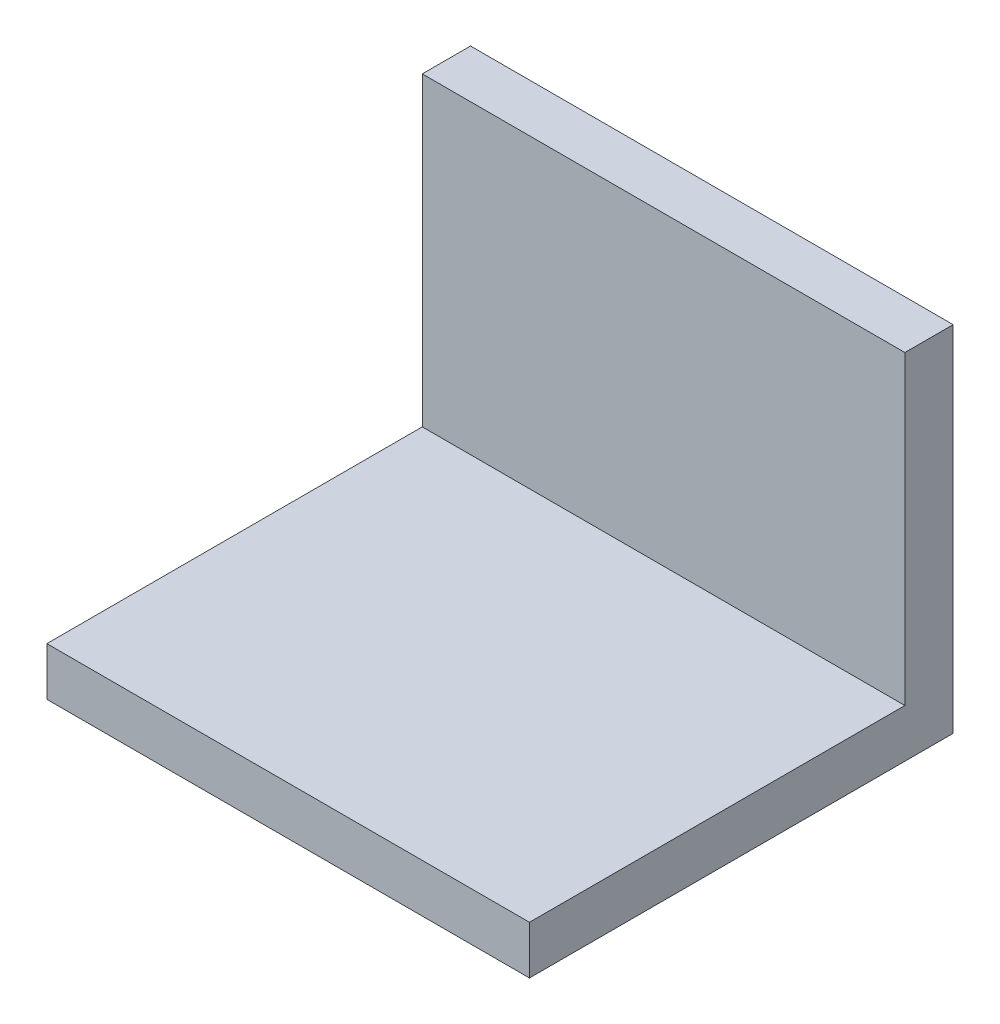
ISO-10303-21;
HEADER;
FILE_DESCRIPTION(('STEP AP214'),'2;1');
FILE_NAME('part.step','',(''),(''),'','','');
FILE_SCHEMA(('AUTOMOTIVE_DESIGN { 1 0 10303 214 1 1 1 1 }'));
ENDSEC;
DATA;
#1=APPLICATION_CONTEXT('core data for automotive mechanical design processes');
#2=APPLICATION_PROTOCOL_DEFINITION('international standard','automotive_design',2000,#1);
#3=PRODUCT_CONTEXT('',#1,'mechanical');
#4=PRODUCT('Part','Part','',(#3));
#5=PRODUCT_RELATED_PRODUCT_CATEGORY('part','',(#4));
#6=PRODUCT_DEFINITION_FORMATION('','',#4);
#7=PRODUCT_DEFINITION_CONTEXT('part definition',#1,'design');
#8=PRODUCT_DEFINITION('design','',#6,#7);
#9=PRODUCT_DEFINITION_SHAPE('','',#8);
#10=(LENGTH_UNIT() NAMED_UNIT(*) SI_UNIT(.MILLI.,.METRE.));
#11=(NAMED_UNIT(*) PLANE_ANGLE_UNIT() SI_UNIT($,.RADIAN.));
#12=(NAMED_UNIT(*) SI_UNIT($,.STERADIAN.) SOLID_ANGLE_UNIT());
#13=UNCERTAINTY_MEASURE_WITH_UNIT(LENGTH_MEASURE(1.E-05),#10,'distance_accuracy_value','');
#14=(GEOMETRIC_REPRESENTATION_CONTEXT(3) GLOBAL_UNCERTAINTY_ASSIGNED_CONTEXT((#13)) GLOBAL_UNIT_ASSIGNED_CONTEXT((#10,
#11,#12)) REPRESENTATION_CONTEXT('',''));
#15=CARTESIAN_POINT('',(0.,0.,0.));
#16=DIRECTION('',(0.,0.,1.));
#17=DIRECTION('',(1.,0.,0.));
#18=AXIS2_PLACEMENT_3D('',#15,#16,#17);
#19=CARTESIAN_POINT('',(-76.2,7.62,0.));
#20=DIRECTION('',(0.,0.,1.));
#21=DIRECTION('',(0.,-1.,0.));
#22=AXIS2_PLACEMENT_3D('',#19,#20,#21);
#23=PLANE('',#22);
#24=DIRECTION('',(0.,-1.,0.));
#25=VECTOR('',#24,1.);
#26=CARTESIAN_POINT('',(0.,7.62,0.));
#27=LINE('',#26,#25);
#28=CARTESIAN_POINT('',(0.,7.62,0.));
#29=VERTEX_POINT('',#28);
#30=CARTESIAN_POINT('',(0.,0.,0.));
#31=VERTEX_POINT('',#30);
#32=EDGE_CURVE('E116',#29,#31,#27,.T.);
#33=ORIENTED_EDGE('',*,*,#32,.F.);
#34=DIRECTION('',(1.,0.,0.));
#35=VECTOR('',#34,1.);
#36=CARTESIAN_POINT('',(-76.2,7.62,0.));
#37=LINE('',#36,#35);
#38=CARTESIAN_POINT('',(-76.2,7.62,0.));
#39=VERTEX_POINT('',#38);
#40=EDGE_CURVE('E11',#39,#29,#37,.T.);
#41=ORIENTED_EDGE('',*,*,#40,.F.);
#42=DIRECTION('',(0.,-1.,0.));
#43=VECTOR('',#42,1.);
#44=CARTESIAN_POINT('',(-76.2,7.62,0.));
#45=LINE('',#44,#43);
#46=CARTESIAN_POINT('',(-76.2,0.,0.));
#47=VERTEX_POINT('',#46);
#48=EDGE_CURVE('E130',#39,#47,#45,.T.);
#49=ORIENTED_EDGE('',*,*,#48,.T.);
#50=DIRECTION('',(1.,0.,0.));
#51=VECTOR('',#50,1.);
#52=CARTESIAN_POINT('',(-76.2,0.,0.));
#53=LINE('',#52,#51);
#54=EDGE_CURVE('E34',#47,#31,#53,.T.);
#55=ORIENTED_EDGE('',*,*,#54,.T.);
#56=EDGE_LOOP('',(#33,#41,#49,#55));
#57=FACE_BOUND('',#56,.T.);
#58=ADVANCED_FACE('F31',(#57),#23,.T.);
#59=CARTESIAN_POINT('',(-76.2,7.62000000000001,-59.2739513263459));
#60=DIRECTION('',(0.,1.,0.));
#61=DIRECTION('',(0.,0.,1.));
#62=AXIS2_PLACEMENT_3D('',#59,#60,#61);
#63=PLANE('',#62);
#64=DIRECTION('',(0.,0.,1.));
#65=VECTOR('',#64,1.);
#66=CARTESIAN_POINT('',(0.,7.62000000000001,-59.2739513263459));
#67=LINE('',#66,#65);
#68=CARTESIAN_POINT('',(0.,7.62000000000001,-59.2739513263459));
#69=VERTEX_POINT('',#68);
#70=EDGE_CURVE('E128',#69,#29,#67,.T.);
#71=ORIENTED_EDGE('',*,*,#70,.F.);
#72=DIRECTION('',(1.,0.,0.));
#73=VECTOR('',#72,1.);
#74=CARTESIAN_POINT('',(-76.2,7.62000000000001,-59.2739513263459));
#75=LINE('',#74,#73);
#76=CARTESIAN_POINT('',(-76.2,7.62000000000001,-59.2739513263459));
#77=VERTEX_POINT('',#76);
#78=EDGE_CURVE('E40',#77,#69,#75,.T.);
#79=ORIENTED_EDGE('',*,*,#78,.F.);
#80=DIRECTION('',(0.,0.,1.));
#81=VECTOR('',#80,1.);
#82=CARTESIAN_POINT('',(-76.2,7.62000000000001,-59.2739513263459));
#83=LINE('',#82,#81);
#84=EDGE_CURVE('E106',#77,#39,#83,.T.);
#85=ORIENTED_EDGE('',*,*,#84,.T.);
#86=ORIENTED_EDGE('',*,*,#40,.T.);
#87=EDGE_LOOP('',(#71,#79,#85,#86));
#88=FACE_BOUND('',#87,.T.);
#89=ADVANCED_FACE('F138',(#88),#63,.T.);
#90=CARTESIAN_POINT('',(-76.2,55.8859317943102,-59.2739513263459));
#91=DIRECTION('',(0.,0.,1.));
#92=DIRECTION('',(0.,-1.,0.));
#93=AXIS2_PLACEMENT_3D('',#90,#91,#92);
#94=PLANE('',#93);
#95=DIRECTION('',(0.,-1.,0.));
#96=VECTOR('',#95,1.);
#97=CARTESIAN_POINT('',(0.,55.8859317943102,-59.2739513263459));
#98=LINE('',#97,#96);
#99=CARTESIAN_POINT('',(0.,55.8859317943102,-59.2739513263459));
#100=VERTEX_POINT('',#99);
#101=EDGE_CURVE('E93',#100,#69,#98,.T.);
#102=ORIENTED_EDGE('',*,*,#101,.F.);
#103=DIRECTION('',(1.,0.,0.));
#104=VECTOR('',#103,1.);
#105=CARTESIAN_POINT('',(-76.2,55.8859317943102,-59.2739513263459));
#106=LINE('',#105,#104);
#107=CARTESIAN_POINT('',(-76.2,55.8859317943102,-59.2739513263459));
#108=VERTEX_POINT('',#107);
#109=EDGE_CURVE('E88',#108,#100,#106,.T.);
#110=ORIENTED_EDGE('',*,*,#109,.F.);
#111=DIRECTION('',(0.,-1.,0.));
#112=VECTOR('',#111,1.);
#113=CARTESIAN_POINT('',(-76.2,55.8859317943102,-59.2739513263459));
#114=LINE('',#113,#112);
#115=EDGE_CURVE('E91',#108,#77,#114,.T.);
#116=ORIENTED_EDGE('',*,*,#115,.T.);
#117=ORIENTED_EDGE('',*,*,#78,.T.);
#118=EDGE_LOOP('',(#102,#110,#116,#117));
#119=FACE_BOUND('',#118,.T.);
#120=ADVANCED_FACE('F90',(#119),#94,.T.);
#121=CARTESIAN_POINT('',(-76.2,55.8859317943102,-66.8939513263459));
#122=DIRECTION('',(0.,1.,0.));
#123=DIRECTION('',(0.,0.,1.));
#124=AXIS2_PLACEMENT_3D('',#121,#122,#123);
#125=PLANE('',#124);
#126=DIRECTION('',(0.,0.,1.));
#127=VECTOR('',#126,1.);
#128=CARTESIAN_POINT('',(0.,55.8859317943102,-66.8939513263459));
#129=LINE('',#128,#127);
#130=CARTESIAN_POINT('',(0.,55.8859317943102,-66.8939513263459));
#131=VERTEX_POINT('',#130);
#132=EDGE_CURVE('E125',#131,#100,#129,.T.);
#133=ORIENTED_EDGE('',*,*,#132,.F.);
#134=DIRECTION('',(1.,0.,0.));
#135=VECTOR('',#134,1.);
#136=CARTESIAN_POINT('',(-76.2,55.8859317943102,-66.8939513263459));
#137=LINE('',#136,#135);
#138=CARTESIAN_POINT('',(-76.2,55.8859317943102,-66.8939513263459));
#139=VERTEX_POINT('',#138);
#140=EDGE_CURVE('E98',#139,#131,#137,.T.);
#141=ORIENTED_EDGE('',*,*,#140,.F.);
#142=DIRECTION('',(0.,0.,1.));
#143=VECTOR('',#142,1.);
#144=CARTESIAN_POINT('',(-76.2,55.8859317943102,-66.8939513263459));
#145=LINE('',#144,#143);
#146=EDGE_CURVE('E104',#139,#108,#145,.T.);
#147=ORIENTED_EDGE('',*,*,#146,.T.);
#148=ORIENTED_EDGE('',*,*,#109,.T.);
#149=EDGE_LOOP('',(#133,#141,#147,#148));
#150=FACE_BOUND('',#149,.T.);
#151=ADVANCED_FACE('F108',(#150),#125,.T.);
#152=CARTESIAN_POINT('',(-76.2,0.,-66.8939513263459));
#153=DIRECTION('',(0.,0.,-1.));
#154=DIRECTION('',(-1.,0.,0.));
#155=AXIS2_PLACEMENT_3D('',#152,#153,#154);
#156=PLANE('',#155);
#157=DIRECTION('',(0.,1.,0.));
#158=VECTOR('',#157,1.);
#159=CARTESIAN_POINT('',(0.,0.,-66.8939513263459));
#160=LINE('',#159,#158);
#161=CARTESIAN_POINT('',(0.,0.,-66.8939513263459));
#162=VERTEX_POINT('',#161);
#163=EDGE_CURVE('E122',#162,#131,#160,.T.);
#164=ORIENTED_EDGE('',*,*,#163,.F.);
#165=DIRECTION('',(1.,0.,0.));
#166=VECTOR('',#165,1.);
#167=CARTESIAN_POINT('',(-76.2,0.,-66.8939513263459));
#168=LINE('',#167,#166);
#169=CARTESIAN_POINT('',(-76.2,0.,-66.8939513263459));
#170=VERTEX_POINT('',#169);
#171=EDGE_CURVE('E133',#170,#162,#168,.T.);
#172=ORIENTED_EDGE('',*,*,#171,.F.);
#173=DIRECTION('',(0.,1.,0.));
#174=VECTOR('',#173,1.);
#175=CARTESIAN_POINT('',(-76.2,0.,-66.8939513263459));
#176=LINE('',#175,#174);
#177=EDGE_CURVE('E109',#170,#139,#176,.T.);
#178=ORIENTED_EDGE('',*,*,#177,.T.);
#179=ORIENTED_EDGE('',*,*,#140,.T.);
#180=EDGE_LOOP('',(#164,#172,#178,#179));
#181=FACE_BOUND('',#180,.T.);
#182=ADVANCED_FACE('F151',(#181),#156,.T.);
#183=CARTESIAN_POINT('',(-76.2,0.,0.));
#184=DIRECTION('',(0.,-1.,0.));
#185=DIRECTION('',(0.,0.,-1.));
#186=AXIS2_PLACEMENT_3D('',#183,#184,#185);
#187=PLANE('',#186);
#188=DIRECTION('',(0.,0.,-1.));
#189=VECTOR('',#188,1.);
#190=CARTESIAN_POINT('',(0.,0.,0.));
#191=LINE('',#190,#189);
#192=EDGE_CURVE('E119',#31,#162,#191,.T.);
#193=ORIENTED_EDGE('',*,*,#192,.F.);
#194=ORIENTED_EDGE('',*,*,#54,.F.);
#195=DIRECTION('',(0.,0.,-1.));
#196=VECTOR('',#195,1.);
#197=CARTESIAN_POINT('',(-76.2,0.,0.));
#198=LINE('',#197,#196);
#199=EDGE_CURVE('E111',#47,#170,#198,.T.);
#200=ORIENTED_EDGE('',*,*,#199,.T.);
#201=ORIENTED_EDGE('',*,*,#171,.T.);
#202=EDGE_LOOP('',(#193,#194,#200,#201));
#203=FACE_BOUND('',#202,.T.);
#204=ADVANCED_FACE('F135',(#203),#187,.T.);
#205=CARTESIAN_POINT('',(-76.2,0.,0.));
#206=DIRECTION('',(1.,0.,0.));
#207=DIRECTION('',(0.,0.,-1.));
#208=AXIS2_PLACEMENT_3D('',#205,#206,#207);
#209=PLANE('',#208);
#210=ORIENTED_EDGE('',*,*,#48,.F.);
#211=ORIENTED_EDGE('',*,*,#84,.F.);
#212=ORIENTED_EDGE('',*,*,#115,.F.);
#213=ORIENTED_EDGE('',*,*,#146,.F.);
#214=ORIENTED_EDGE('',*,*,#177,.F.);
#215=ORIENTED_EDGE('',*,*,#199,.F.);
#216=EDGE_LOOP('',(#210,#211,#212,#213,#214,#215));
#217=FACE_BOUND('',#216,.T.);
#218=ADVANCED_FACE('F102',(#217),#209,.F.);
#219=CARTESIAN_POINT('',(0.,0.,0.));
#220=DIRECTION('',(1.,0.,0.));
#221=DIRECTION('',(0.,0.,-1.));
#222=AXIS2_PLACEMENT_3D('',#219,#220,#221);
#223=PLANE('',#222);
#224=ORIENTED_EDGE('',*,*,#32,.T.);
#225=ORIENTED_EDGE('',*,*,#192,.T.);
#226=ORIENTED_EDGE('',*,*,#163,.T.);
#227=ORIENTED_EDGE('',*,*,#132,.T.);
#228=ORIENTED_EDGE('',*,*,#101,.T.);
#229=ORIENTED_EDGE('',*,*,#70,.T.);
#230=EDGE_LOOP('',(#224,#225,#226,#227,#228,#229));
#231=FACE_BOUND('',#230,.T.);
#232=ADVANCED_FACE('F137',(#231),#223,.T.);
#233=CLOSED_SHELL('',(#58,#89,#120,#151,#182,#204,#218,#232));
#234=MANIFOLD_SOLID_BREP('B2',#233);
#235=ADVANCED_BREP_SHAPE_REPRESENTATION('',(#18,#234),#14);
#236=SHAPE_DEFINITION_REPRESENTATION(#9,#235);
ENDSEC;
END-ISO-10303-21;
